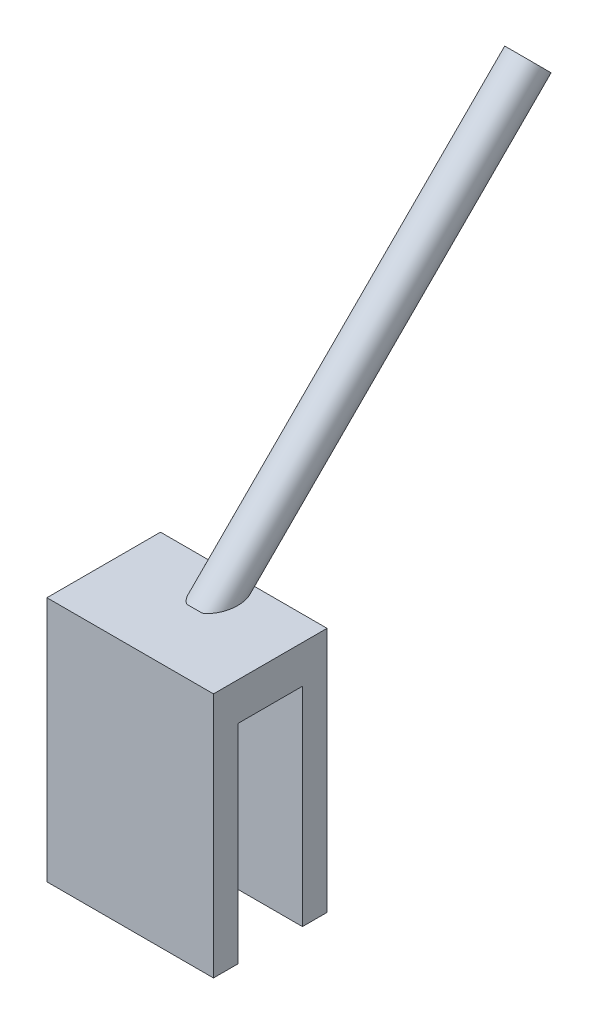
ISO-10303-21;
HEADER;
FILE_DESCRIPTION(('STEP AP214'),'2;1');
FILE_NAME('part.step','',(''),(''),'','','');
FILE_SCHEMA(('AUTOMOTIVE_DESIGN { 1 0 10303 214 1 1 1 1 }'));
ENDSEC;
DATA;
#1=APPLICATION_CONTEXT('core data for automotive mechanical design processes');
#2=APPLICATION_PROTOCOL_DEFINITION('international standard','automotive_design',2000,#1);
#3=PRODUCT_CONTEXT('',#1,'mechanical');
#4=PRODUCT('Part','Part','',(#3));
#5=PRODUCT_RELATED_PRODUCT_CATEGORY('part','',(#4));
#6=PRODUCT_DEFINITION_FORMATION('','',#4);
#7=PRODUCT_DEFINITION_CONTEXT('part definition',#1,'design');
#8=PRODUCT_DEFINITION('design','',#6,#7);
#9=PRODUCT_DEFINITION_SHAPE('','',#8);
#10=(LENGTH_UNIT() NAMED_UNIT(*) SI_UNIT(.MILLI.,.METRE.));
#11=(NAMED_UNIT(*) PLANE_ANGLE_UNIT() SI_UNIT($,.RADIAN.));
#12=(NAMED_UNIT(*) SI_UNIT($,.STERADIAN.) SOLID_ANGLE_UNIT());
#13=UNCERTAINTY_MEASURE_WITH_UNIT(LENGTH_MEASURE(1.E-05),#10,'distance_accuracy_value','');
#14=(GEOMETRIC_REPRESENTATION_CONTEXT(3) GLOBAL_UNCERTAINTY_ASSIGNED_CONTEXT((#13)) GLOBAL_UNIT_ASSIGNED_CONTEXT((#10,
#11,#12)) REPRESENTATION_CONTEXT('',''));
#15=CARTESIAN_POINT('',(0.,0.,0.));
#16=DIRECTION('',(0.,0.,1.));
#17=DIRECTION('',(1.,0.,0.));
#18=AXIS2_PLACEMENT_3D('',#15,#16,#17);
#19=CARTESIAN_POINT('',(0.,65.,0.));
#20=DIRECTION('',(0.,-1.,0.));
#21=DIRECTION('',(0.,0.,-1.));
#22=AXIS2_PLACEMENT_3D('',#19,#20,#21);
#23=PLANE('',#22);
#24=CARTESIAN_POINT('',(-7.86220424258403E-13,65.,-8.43145750507583));
#25=DIRECTION('',(0.,-1.,0.));
#26=DIRECTION('',(0.,0.,1.));
#27=AXIS2_PLACEMENT_3D('',#24,#25,#26);
#28=ELLIPSE('',#27,7.07106781186544,5.);
#29=CARTESIAN_POINT('',(2.03875649109073,65.,-1.97491478160035));
#30=VERTEX_POINT('',#29);
#31=CARTESIAN_POINT('',(1.85124950943529,65.,-15.));
#32=VERTEX_POINT('',#31);
#33=EDGE_CURVE('E11',#30,#32,#28,.F.);
#34=ORIENTED_EDGE('',*,*,#33,.F.);
#35=DIRECTION('',(1.,0.,0.));
#36=VECTOR('',#35,1.);
#37=CARTESIAN_POINT('',(0.,65.,-1.97491478160033));
#38=LINE('',#37,#36);
#39=CARTESIAN_POINT('',(-2.03875649109215,65.,-1.9749147816003));
#40=VERTEX_POINT('',#39);
#41=EDGE_CURVE('E55',#40,#30,#38,.T.);
#42=ORIENTED_EDGE('',*,*,#41,.F.);
#43=CARTESIAN_POINT('',(-1.85124950943694,65.,-15.));
#44=VERTEX_POINT('',#43);
#45=EDGE_CURVE('E43',#44,#40,#28,.F.);
#46=ORIENTED_EDGE('',*,*,#45,.F.);
#47=DIRECTION('',(-1.,0.,0.));
#48=VECTOR('',#47,1.);
#49=CARTESIAN_POINT('',(-22.,65.,-15.));
#50=LINE('',#49,#48);
#51=CARTESIAN_POINT('',(-22.,65.,-15.));
#52=VERTEX_POINT('',#51);
#53=EDGE_CURVE('E177',#44,#52,#50,.T.);
#54=ORIENTED_EDGE('',*,*,#53,.T.);
#55=DIRECTION('',(0.,0.,1.));
#56=VECTOR('',#55,1.);
#57=CARTESIAN_POINT('',(-22.,65.,15.));
#58=LINE('',#57,#56);
#59=CARTESIAN_POINT('',(-22.,65.,15.));
#60=VERTEX_POINT('',#59);
#61=EDGE_CURVE('E181',#52,#60,#58,.T.);
#62=ORIENTED_EDGE('',*,*,#61,.T.);
#63=DIRECTION('',(1.,0.,0.));
#64=VECTOR('',#63,1.);
#65=CARTESIAN_POINT('',(-22.,65.,15.));
#66=LINE('',#65,#64);
#67=CARTESIAN_POINT('',(22.,65.,15.));
#68=VERTEX_POINT('',#67);
#69=EDGE_CURVE('E184',#60,#68,#66,.T.);
#70=ORIENTED_EDGE('',*,*,#69,.T.);
#71=DIRECTION('',(0.,0.,-1.));
#72=VECTOR('',#71,1.);
#73=CARTESIAN_POINT('',(22.,65.,15.));
#74=LINE('',#73,#72);
#75=CARTESIAN_POINT('',(22.,65.,-15.));
#76=VERTEX_POINT('',#75);
#77=EDGE_CURVE('E174',#68,#76,#74,.T.);
#78=ORIENTED_EDGE('',*,*,#77,.T.);
#79=EDGE_CURVE('E113',#76,#32,#50,.T.);
#80=ORIENTED_EDGE('',*,*,#79,.T.);
#81=EDGE_LOOP('',(#34,#42,#46,#54,#62,#70,#78,#80));
#82=FACE_BOUND('',#81,.T.);
#83=ADVANCED_FACE('F39',(#82),#23,.F.);
#84=CARTESIAN_POINT('',(0.,0.,0.));
#85=DIRECTION('',(0.,-1.,0.));
#86=DIRECTION('',(0.,0.,-1.));
#87=AXIS2_PLACEMENT_3D('',#84,#85,#86);
#88=PLANE('',#87);
#89=DIRECTION('',(1.,0.,0.));
#90=VECTOR('',#89,1.);
#91=CARTESIAN_POINT('',(-22.,0.,8.5));
#92=LINE('',#91,#90);
#93=CARTESIAN_POINT('',(-22.,0.,8.5));
#94=VERTEX_POINT('',#93);
#95=CARTESIAN_POINT('',(22.,0.,8.5));
#96=VERTEX_POINT('',#95);
#97=EDGE_CURVE('E146',#94,#96,#92,.T.);
#98=ORIENTED_EDGE('',*,*,#97,.T.);
#99=DIRECTION('',(0.,0.,-1.));
#100=VECTOR('',#99,1.);
#101=CARTESIAN_POINT('',(22.,0.,15.));
#102=LINE('',#101,#100);
#103=CARTESIAN_POINT('',(22.,0.,15.));
#104=VERTEX_POINT('',#103);
#105=EDGE_CURVE('E188',#104,#96,#102,.T.);
#106=ORIENTED_EDGE('',*,*,#105,.F.);
#107=DIRECTION('',(1.,0.,0.));
#108=VECTOR('',#107,1.);
#109=CARTESIAN_POINT('',(-22.,0.,15.));
#110=LINE('',#109,#108);
#111=CARTESIAN_POINT('',(-22.,0.,15.));
#112=VERTEX_POINT('',#111);
#113=EDGE_CURVE('E178',#112,#104,#110,.T.);
#114=ORIENTED_EDGE('',*,*,#113,.F.);
#115=DIRECTION('',(0.,0.,1.));
#116=VECTOR('',#115,1.);
#117=CARTESIAN_POINT('',(-22.,0.,15.));
#118=LINE('',#117,#116);
#119=EDGE_CURVE('E195',#94,#112,#118,.T.);
#120=ORIENTED_EDGE('',*,*,#119,.F.);
#121=EDGE_LOOP('',(#98,#106,#114,#120));
#122=FACE_BOUND('',#121,.T.);
#123=ADVANCED_FACE('F243',(#122),#88,.T.);
#124=CARTESIAN_POINT('',(22.,65.,15.));
#125=DIRECTION('',(-1.,0.,0.));
#126=DIRECTION('',(0.,0.,1.));
#127=AXIS2_PLACEMENT_3D('',#124,#125,#126);
#128=PLANE('',#127);
#129=ORIENTED_EDGE('',*,*,#105,.T.);
#130=DIRECTION('',(0.,1.,0.));
#131=VECTOR('',#130,1.);
#132=CARTESIAN_POINT('',(22.,65.,8.5));
#133=LINE('',#132,#131);
#134=CARTESIAN_POINT('',(22.,55.,8.5));
#135=VERTEX_POINT('',#134);
#136=EDGE_CURVE('E165',#96,#135,#133,.T.);
#137=ORIENTED_EDGE('',*,*,#136,.T.);
#138=DIRECTION('',(0.,0.,-1.));
#139=VECTOR('',#138,1.);
#140=CARTESIAN_POINT('',(22.,55.,15.));
#141=LINE('',#140,#139);
#142=CARTESIAN_POINT('',(22.,55.,-8.5));
#143=VERTEX_POINT('',#142);
#144=EDGE_CURVE('E169',#135,#143,#141,.T.);
#145=ORIENTED_EDGE('',*,*,#144,.T.);
#146=DIRECTION('',(0.,-1.,0.));
#147=VECTOR('',#146,1.);
#148=CARTESIAN_POINT('',(22.,65.,-8.5));
#149=LINE('',#148,#147);
#150=CARTESIAN_POINT('',(22.,0.,-8.5));
#151=VERTEX_POINT('',#150);
#152=EDGE_CURVE('E151',#143,#151,#149,.T.);
#153=ORIENTED_EDGE('',*,*,#152,.T.);
#154=CARTESIAN_POINT('',(22.,0.,-15.));
#155=VERTEX_POINT('',#154);
#156=EDGE_CURVE('E173',#151,#155,#102,.T.);
#157=ORIENTED_EDGE('',*,*,#156,.T.);
#158=DIRECTION('',(0.,-1.,0.));
#159=VECTOR('',#158,1.);
#160=CARTESIAN_POINT('',(22.,65.,-15.));
#161=LINE('',#160,#159);
#162=EDGE_CURVE('E122',#76,#155,#161,.T.);
#163=ORIENTED_EDGE('',*,*,#162,.F.);
#164=ORIENTED_EDGE('',*,*,#77,.F.);
#165=DIRECTION('',(0.,-1.,0.));
#166=VECTOR('',#165,1.);
#167=CARTESIAN_POINT('',(22.,65.,15.));
#168=LINE('',#167,#166);
#169=EDGE_CURVE('E187',#68,#104,#168,.T.);
#170=ORIENTED_EDGE('',*,*,#169,.T.);
#171=EDGE_LOOP('',(#129,#137,#145,#153,#157,#163,#164,#170));
#172=FACE_BOUND('',#171,.T.);
#173=ADVANCED_FACE('F41',(#172),#128,.F.);
#174=CARTESIAN_POINT('',(-22.,65.,-15.));
#175=DIRECTION('',(0.,0.,1.));
#176=DIRECTION('',(1.,0.,0.));
#177=AXIS2_PLACEMENT_3D('',#174,#175,#176);
#178=PLANE('',#177);
#179=CARTESIAN_POINT('',(-8.66557240810592E-13,71.5685424949242,-15.));
#180=DIRECTION('',(0.,0.,1.));
#181=DIRECTION('',(0.,-1.,0.));
#182=AXIS2_PLACEMENT_3D('',#179,#180,#181);
#183=ELLIPSE('',#182,7.07106781186551,5.);
#184=EDGE_CURVE('E129',#32,#44,#183,.F.);
#185=ORIENTED_EDGE('',*,*,#184,.F.);
#186=ORIENTED_EDGE('',*,*,#79,.F.);
#187=ORIENTED_EDGE('',*,*,#162,.T.);
#188=DIRECTION('',(-1.,0.,0.));
#189=VECTOR('',#188,1.);
#190=CARTESIAN_POINT('',(-22.,0.,-15.));
#191=LINE('',#190,#189);
#192=CARTESIAN_POINT('',(-22.,0.,-15.));
#193=VERTEX_POINT('',#192);
#194=EDGE_CURVE('E192',#155,#193,#191,.T.);
#195=ORIENTED_EDGE('',*,*,#194,.T.);
#196=DIRECTION('',(0.,-1.,0.));
#197=VECTOR('',#196,1.);
#198=CARTESIAN_POINT('',(-22.,65.,-15.));
#199=LINE('',#198,#197);
#200=EDGE_CURVE('E209',#52,#193,#199,.T.);
#201=ORIENTED_EDGE('',*,*,#200,.F.);
#202=ORIENTED_EDGE('',*,*,#53,.F.);
#203=EDGE_LOOP('',(#185,#186,#187,#195,#201,#202));
#204=FACE_BOUND('',#203,.T.);
#205=ADVANCED_FACE('F217',(#204),#178,.F.);
#206=CARTESIAN_POINT('',(-22.,65.,15.));
#207=DIRECTION('',(1.,0.,0.));
#208=DIRECTION('',(0.,0.,-1.));
#209=AXIS2_PLACEMENT_3D('',#206,#207,#208);
#210=PLANE('',#209);
#211=DIRECTION('',(0.,0.,1.));
#212=VECTOR('',#211,1.);
#213=CARTESIAN_POINT('',(-22.,55.,8.5));
#214=LINE('',#213,#212);
#215=CARTESIAN_POINT('',(-22.,55.,-8.5));
#216=VERTEX_POINT('',#215);
#217=CARTESIAN_POINT('',(-22.,55.,8.5));
#218=VERTEX_POINT('',#217);
#219=EDGE_CURVE('E142',#216,#218,#214,.T.);
#220=ORIENTED_EDGE('',*,*,#219,.T.);
#221=DIRECTION('',(0.,-1.,0.));
#222=VECTOR('',#221,1.);
#223=CARTESIAN_POINT('',(-22.,0.,8.5));
#224=LINE('',#223,#222);
#225=EDGE_CURVE('E134',#218,#94,#224,.T.);
#226=ORIENTED_EDGE('',*,*,#225,.T.);
#227=ORIENTED_EDGE('',*,*,#119,.T.);
#228=DIRECTION('',(0.,-1.,0.));
#229=VECTOR('',#228,1.);
#230=CARTESIAN_POINT('',(-22.,65.,15.));
#231=LINE('',#230,#229);
#232=EDGE_CURVE('E205',#60,#112,#231,.T.);
#233=ORIENTED_EDGE('',*,*,#232,.F.);
#234=ORIENTED_EDGE('',*,*,#61,.F.);
#235=ORIENTED_EDGE('',*,*,#200,.T.);
#236=CARTESIAN_POINT('',(-22.,0.,-8.5));
#237=VERTEX_POINT('',#236);
#238=EDGE_CURVE('E196',#193,#237,#118,.T.);
#239=ORIENTED_EDGE('',*,*,#238,.T.);
#240=DIRECTION('',(0.,1.,0.));
#241=VECTOR('',#240,1.);
#242=CARTESIAN_POINT('',(-22.,0.,-8.5));
#243=LINE('',#242,#241);
#244=EDGE_CURVE('E138',#237,#216,#243,.T.);
#245=ORIENTED_EDGE('',*,*,#244,.T.);
#246=EDGE_LOOP('',(#220,#226,#227,#233,#234,#235,#239,#245));
#247=FACE_BOUND('',#246,.T.);
#248=ADVANCED_FACE('F229',(#247),#210,.F.);
#249=CARTESIAN_POINT('',(-22.,65.,15.));
#250=DIRECTION('',(0.,0.,-1.));
#251=DIRECTION('',(-1.,0.,0.));
#252=AXIS2_PLACEMENT_3D('',#249,#250,#251);
#253=PLANE('',#252);
#254=ORIENTED_EDGE('',*,*,#113,.T.);
#255=ORIENTED_EDGE('',*,*,#169,.F.);
#256=ORIENTED_EDGE('',*,*,#69,.F.);
#257=ORIENTED_EDGE('',*,*,#232,.T.);
#258=EDGE_LOOP('',(#254,#255,#256,#257));
#259=FACE_BOUND('',#258,.T.);
#260=ADVANCED_FACE('F240',(#259),#253,.F.);
#261=DIRECTION('',(1.,0.,0.));
#262=VECTOR('',#261,1.);
#263=CARTESIAN_POINT('',(-22.,0.,-8.5));
#264=LINE('',#263,#262);
#265=EDGE_CURVE('E156',#237,#151,#264,.T.);
#266=ORIENTED_EDGE('',*,*,#265,.F.);
#267=ORIENTED_EDGE('',*,*,#238,.F.);
#268=ORIENTED_EDGE('',*,*,#194,.F.);
#269=ORIENTED_EDGE('',*,*,#156,.F.);
#270=EDGE_LOOP('',(#266,#267,#268,#269));
#271=FACE_BOUND('',#270,.T.);
#272=ADVANCED_FACE('F227',(#271),#88,.T.);
#273=CARTESIAN_POINT('',(-22.,55.,8.5));
#274=DIRECTION('',(0.,1.,0.));
#275=DIRECTION('',(0.,0.,1.));
#276=AXIS2_PLACEMENT_3D('',#273,#274,#275);
#277=PLANE('',#276);
#278=DIRECTION('',(1.,0.,0.));
#279=VECTOR('',#278,1.);
#280=CARTESIAN_POINT('',(-22.,55.,8.5));
#281=LINE('',#280,#279);
#282=EDGE_CURVE('E147',#218,#135,#281,.T.);
#283=ORIENTED_EDGE('',*,*,#282,.F.);
#284=ORIENTED_EDGE('',*,*,#219,.F.);
#285=DIRECTION('',(1.,0.,0.));
#286=VECTOR('',#285,1.);
#287=CARTESIAN_POINT('',(-22.,55.,-8.5));
#288=LINE('',#287,#286);
#289=EDGE_CURVE('E152',#216,#143,#288,.T.);
#290=ORIENTED_EDGE('',*,*,#289,.T.);
#291=ORIENTED_EDGE('',*,*,#144,.F.);
#292=EDGE_LOOP('',(#283,#284,#290,#291));
#293=FACE_BOUND('',#292,.T.);
#294=ADVANCED_FACE('F248',(#293),#277,.F.);
#295=CARTESIAN_POINT('',(-22.,0.,8.5));
#296=DIRECTION('',(0.,0.,1.));
#297=DIRECTION('',(1.,0.,0.));
#298=AXIS2_PLACEMENT_3D('',#295,#296,#297);
#299=PLANE('',#298);
#300=ORIENTED_EDGE('',*,*,#97,.F.);
#301=ORIENTED_EDGE('',*,*,#225,.F.);
#302=ORIENTED_EDGE('',*,*,#282,.T.);
#303=ORIENTED_EDGE('',*,*,#136,.F.);
#304=EDGE_LOOP('',(#300,#301,#302,#303));
#305=FACE_BOUND('',#304,.T.);
#306=ADVANCED_FACE('F245',(#305),#299,.F.);
#307=CARTESIAN_POINT('',(-22.,0.,-8.5));
#308=DIRECTION('',(0.,0.,-1.));
#309=DIRECTION('',(-1.,0.,0.));
#310=AXIS2_PLACEMENT_3D('',#307,#308,#309);
#311=PLANE('',#310);
#312=ORIENTED_EDGE('',*,*,#289,.F.);
#313=ORIENTED_EDGE('',*,*,#244,.F.);
#314=ORIENTED_EDGE('',*,*,#265,.T.);
#315=ORIENTED_EDGE('',*,*,#152,.F.);
#316=EDGE_LOOP('',(#312,#313,#314,#315));
#317=FACE_BOUND('',#316,.T.);
#318=ADVANCED_FACE('F250',(#317),#311,.F.);
#319=CARTESIAN_POINT('',(-1.78453259053543E-12,146.624542380648,-90.0559998857234));
#320=DIRECTION('',(0.,-0.707106781186551,0.707106781186544));
#321=DIRECTION('',(0.,-0.707106781186544,-0.707106781186551));
#322=AXIS2_PLACEMENT_3D('',#319,#320,#321);
#323=CYLINDRICAL_SURFACE('',#322,5.);
#324=CARTESIAN_POINT('',(-1.78453259053543E-12,146.624542380648,-90.0559998857234));
#325=DIRECTION('',(0.,0.707106781186551,-0.707106781186544));
#326=DIRECTION('',(0.,0.707106781186544,0.707106781186551));
#327=AXIS2_PLACEMENT_3D('',#324,#325,#326);
#328=CIRCLE('',#327,5.);
#329=CARTESIAN_POINT('',(-1.78453259053543E-12,150.160076286581,-86.5204659797907));
#330=VERTEX_POINT('',#329);
#331=EDGE_CURVE('E125',#330,#330,#328,.T.);
#332=ORIENTED_EDGE('',*,*,#331,.F.);
#333=EDGE_LOOP('',(#332));
#334=FACE_BOUND('',#333,.T.);
#335=CARTESIAN_POINT('',(-7.46736924780548E-13,61.7717286382622,-5.20318614333811));
#336=DIRECTION('',(0.,0.707106781186551,-0.707106781186544));
#337=DIRECTION('',(0.,0.707106781186544,0.707106781186551));
#338=AXIS2_PLACEMENT_3D('',#335,#336,#337);
#339=CIRCLE('',#338,5.);
#340=EDGE_CURVE('E120',#40,#30,#339,.T.);
#341=ORIENTED_EDGE('',*,*,#340,.T.);
#342=ORIENTED_EDGE('',*,*,#33,.T.);
#343=ORIENTED_EDGE('',*,*,#184,.T.);
#344=ORIENTED_EDGE('',*,*,#45,.T.);
#345=EDGE_LOOP('',(#341,#342,#343,#344));
#346=FACE_BOUND('',#345,.T.);
#347=ADVANCED_FACE('F123',(#334,#346),#323,.T.);
#348=CARTESIAN_POINT('',(-7.46736924780548E-13,61.7717286382622,-5.20318614333811));
#349=DIRECTION('',(0.,0.707106781186551,-0.707106781186544));
#350=DIRECTION('',(0.,0.707106781186544,0.707106781186551));
#351=AXIS2_PLACEMENT_3D('',#348,#349,#350);
#352=PLANE('',#351);
#353=ORIENTED_EDGE('',*,*,#340,.F.);
#354=ORIENTED_EDGE('',*,*,#41,.T.);
#355=EDGE_LOOP('',(#353,#354));
#356=FACE_BOUND('',#355,.T.);
#357=ADVANCED_FACE('F119',(#356),#352,.F.);
#358=CARTESIAN_POINT('',(-1.78453259053543E-12,146.624542380648,-90.0559998857234));
#359=DIRECTION('',(0.,0.707106781186551,-0.707106781186544));
#360=DIRECTION('',(0.,0.707106781186544,0.707106781186551));
#361=AXIS2_PLACEMENT_3D('',#358,#359,#360);
#362=PLANE('',#361);
#363=ORIENTED_EDGE('',*,*,#331,.T.);
#364=EDGE_LOOP('',(#363));
#365=FACE_BOUND('',#364,.T.);
#366=ADVANCED_FACE('F333',(#365),#362,.T.);
#367=CLOSED_SHELL('',(#83,#123,#173,#205,#248,#260,#272,#294,#306,#318,#347,#357,#366));
#368=MANIFOLD_SOLID_BREP('B2',#367);
#369=ADVANCED_BREP_SHAPE_REPRESENTATION('',(#18,#368),#14);
#370=SHAPE_DEFINITION_REPRESENTATION(#9,#369);
ENDSEC;
END-ISO-10303-21;
